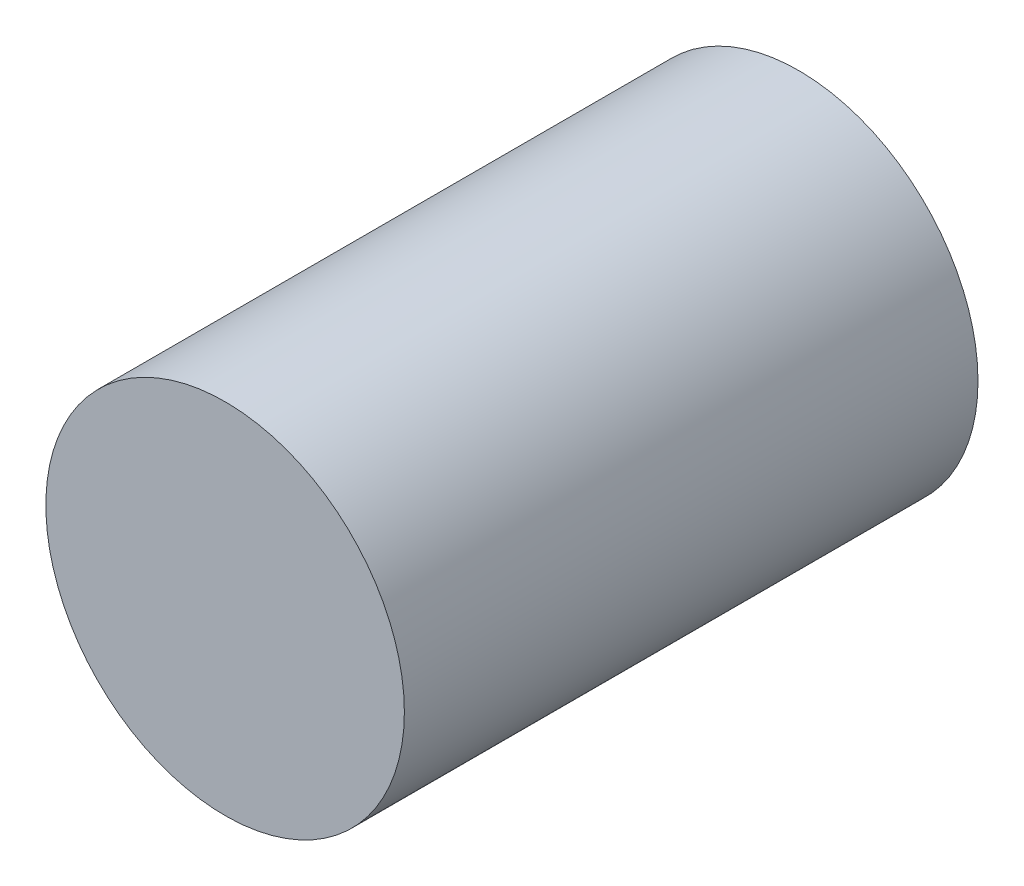
ISO-10303-21;
HEADER;
FILE_DESCRIPTION(('STEP AP214'),'2;1');
FILE_NAME('part.step','',(''),(''),'','','');
FILE_SCHEMA(('AUTOMOTIVE_DESIGN { 1 0 10303 214 1 1 1 1 }'));
ENDSEC;
DATA;
#1=APPLICATION_CONTEXT('core data for automotive mechanical design processes');
#2=APPLICATION_PROTOCOL_DEFINITION('international standard','automotive_design',2000,#1);
#3=PRODUCT_CONTEXT('',#1,'mechanical');
#4=PRODUCT('Part','Part','',(#3));
#5=PRODUCT_RELATED_PRODUCT_CATEGORY('part','',(#4));
#6=PRODUCT_DEFINITION_FORMATION('','',#4);
#7=PRODUCT_DEFINITION_CONTEXT('part definition',#1,'design');
#8=PRODUCT_DEFINITION('design','',#6,#7);
#9=PRODUCT_DEFINITION_SHAPE('','',#8);
#10=(LENGTH_UNIT() NAMED_UNIT(*) SI_UNIT(.MILLI.,.METRE.));
#11=(NAMED_UNIT(*) PLANE_ANGLE_UNIT() SI_UNIT($,.RADIAN.));
#12=(NAMED_UNIT(*) SI_UNIT($,.STERADIAN.) SOLID_ANGLE_UNIT());
#13=UNCERTAINTY_MEASURE_WITH_UNIT(LENGTH_MEASURE(1.E-05),#10,'distance_accuracy_value','');
#14=(GEOMETRIC_REPRESENTATION_CONTEXT(3) GLOBAL_UNCERTAINTY_ASSIGNED_CONTEXT((#13)) GLOBAL_UNIT_ASSIGNED_CONTEXT((#10,
#11,#12)) REPRESENTATION_CONTEXT('',''));
#15=CARTESIAN_POINT('',(0.,0.,0.));
#16=DIRECTION('',(0.,0.,1.));
#17=DIRECTION('',(1.,0.,0.));
#18=AXIS2_PLACEMENT_3D('',#15,#16,#17);
#19=CARTESIAN_POINT('',(0.,0.,16.));
#20=DIRECTION('',(0.,0.,-1.));
#21=DIRECTION('',(-1.,0.,0.));
#22=AXIS2_PLACEMENT_3D('',#19,#20,#21);
#23=CYLINDRICAL_SURFACE('',#22,5.);
#24=CARTESIAN_POINT('',(0.,0.,16.));
#25=DIRECTION('',(0.,0.,1.));
#26=DIRECTION('',(1.,0.,0.));
#27=AXIS2_PLACEMENT_3D('',#24,#25,#26);
#28=CIRCLE('',#27,5.);
#29=CARTESIAN_POINT('',(5.,0.,16.));
#30=VERTEX_POINT('',#29);
#31=EDGE_CURVE('E10',#30,#30,#28,.T.);
#32=ORIENTED_EDGE('',*,*,#31,.F.);
#33=EDGE_LOOP('',(#32));
#34=FACE_BOUND('',#33,.T.);
#35=CARTESIAN_POINT('',(0.,0.,0.));
#36=DIRECTION('',(0.,0.,1.));
#37=DIRECTION('',(1.,0.,0.));
#38=AXIS2_PLACEMENT_3D('',#35,#36,#37);
#39=CIRCLE('',#38,5.);
#40=CARTESIAN_POINT('',(5.,0.,0.));
#41=VERTEX_POINT('',#40);
#42=EDGE_CURVE('E38',#41,#41,#39,.T.);
#43=ORIENTED_EDGE('',*,*,#42,.T.);
#44=EDGE_LOOP('',(#43));
#45=FACE_BOUND('',#44,.T.);
#46=ADVANCED_FACE('F35',(#34,#45),#23,.T.);
#47=CARTESIAN_POINT('',(0.,0.,16.));
#48=DIRECTION('',(0.,0.,1.));
#49=DIRECTION('',(1.,0.,0.));
#50=AXIS2_PLACEMENT_3D('',#47,#48,#49);
#51=PLANE('',#50);
#52=ORIENTED_EDGE('',*,*,#31,.T.);
#53=EDGE_LOOP('',(#52));
#54=FACE_BOUND('',#53,.T.);
#55=ADVANCED_FACE('F50',(#54),#51,.T.);
#56=CARTESIAN_POINT('',(0.,0.,0.));
#57=DIRECTION('',(0.,0.,1.));
#58=DIRECTION('',(1.,0.,0.));
#59=AXIS2_PLACEMENT_3D('',#56,#57,#58);
#60=PLANE('',#59);
#61=ORIENTED_EDGE('',*,*,#42,.F.);
#62=EDGE_LOOP('',(#61));
#63=FACE_BOUND('',#62,.T.);
#64=ADVANCED_FACE('F48',(#63),#60,.F.);
#65=CLOSED_SHELL('',(#46,#55,#64));
#66=MANIFOLD_SOLID_BREP('B2',#65);
#67=ADVANCED_BREP_SHAPE_REPRESENTATION('',(#18,#66),#14);
#68=SHAPE_DEFINITION_REPRESENTATION(#9,#67);
ENDSEC;
END-ISO-10303-21;
